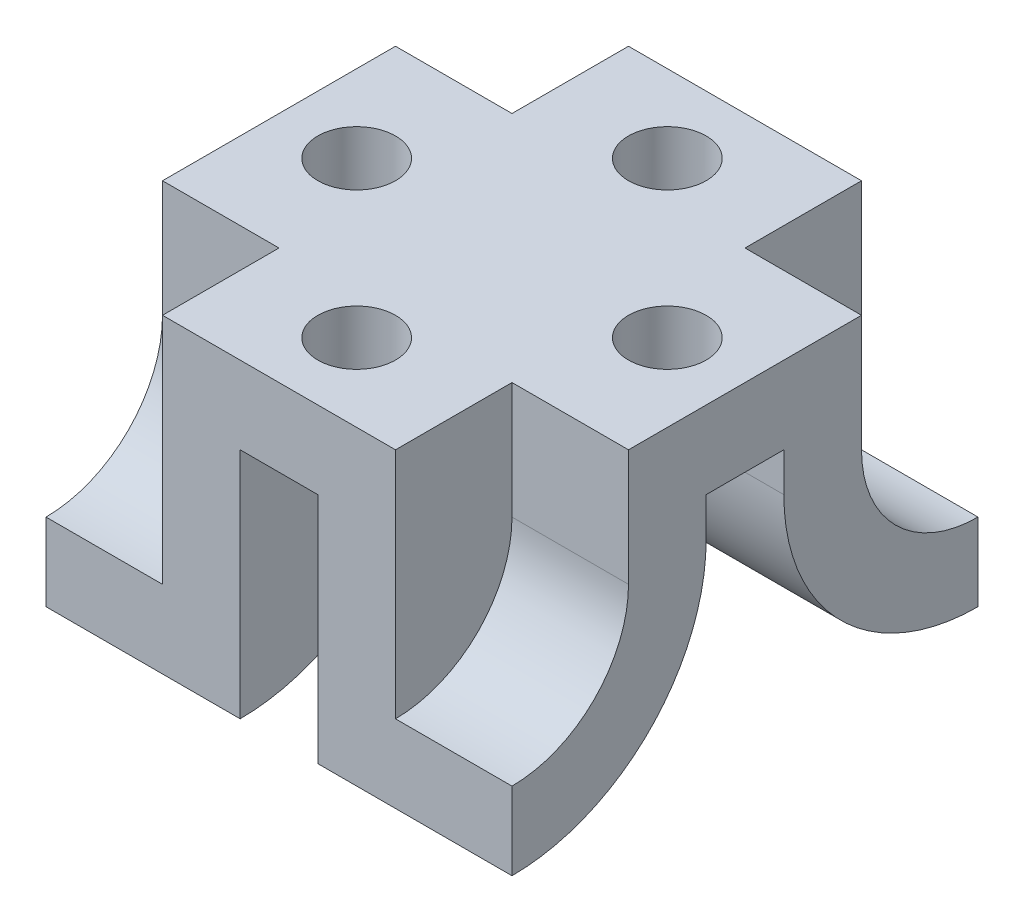
ISO-10303-21;
HEADER;
FILE_DESCRIPTION(('STEP AP214'),'2;1');
FILE_NAME('part.step','',(''),(''),'','','');
FILE_SCHEMA(('AUTOMOTIVE_DESIGN { 1 0 10303 214 1 1 1 1 }'));
ENDSEC;
DATA;
#1=APPLICATION_CONTEXT('core data for automotive mechanical design processes');
#2=APPLICATION_PROTOCOL_DEFINITION('international standard','automotive_design',2000,#1);
#3=PRODUCT_CONTEXT('',#1,'mechanical');
#4=PRODUCT('Part','Part','',(#3));
#5=PRODUCT_RELATED_PRODUCT_CATEGORY('part','',(#4));
#6=PRODUCT_DEFINITION_FORMATION('','',#4);
#7=PRODUCT_DEFINITION_CONTEXT('part definition',#1,'design');
#8=PRODUCT_DEFINITION('design','',#6,#7);
#9=PRODUCT_DEFINITION_SHAPE('','',#8);
#10=(LENGTH_UNIT() NAMED_UNIT(*) SI_UNIT(.MILLI.,.METRE.));
#11=(NAMED_UNIT(*) PLANE_ANGLE_UNIT() SI_UNIT($,.RADIAN.));
#12=(NAMED_UNIT(*) SI_UNIT($,.STERADIAN.) SOLID_ANGLE_UNIT());
#13=UNCERTAINTY_MEASURE_WITH_UNIT(LENGTH_MEASURE(1.E-05),#10,'distance_accuracy_value','');
#14=(GEOMETRIC_REPRESENTATION_CONTEXT(3) GLOBAL_UNCERTAINTY_ASSIGNED_CONTEXT((#13)) GLOBAL_UNIT_ASSIGNED_CONTEXT((#10,
#11,#12)) REPRESENTATION_CONTEXT('',''));
#15=CARTESIAN_POINT('',(0.,0.,0.));
#16=DIRECTION('',(0.,0.,1.));
#17=DIRECTION('',(1.,0.,0.));
#18=AXIS2_PLACEMENT_3D('',#15,#16,#17);
#19=CARTESIAN_POINT('',(0.,12.,-12.));
#20=DIRECTION('',(0.,-1.,0.));
#21=DIRECTION('',(0.,0.,-1.));
#22=AXIS2_PLACEMENT_3D('',#19,#20,#21);
#23=PLANE('',#22);
#24=CARTESIAN_POINT('',(0.,12.,-8.));
#25=DIRECTION('',(0.,-1.,0.));
#26=DIRECTION('',(0.,0.,-1.));
#27=AXIS2_PLACEMENT_3D('',#24,#25,#26);
#28=CIRCLE('',#27,2.);
#29=CARTESIAN_POINT('',(2.,12.,-8.));
#30=VERTEX_POINT('',#29);
#31=CARTESIAN_POINT('',(-2.,12.,-8.));
#32=VERTEX_POINT('',#31);
#33=EDGE_CURVE('E11',#30,#32,#28,.T.);
#34=ORIENTED_EDGE('',*,*,#33,.F.);
#35=DIRECTION('',(0.,0.,1.));
#36=VECTOR('',#35,1.);
#37=CARTESIAN_POINT('',(2.,12.,-12.));
#38=LINE('',#37,#36);
#39=CARTESIAN_POINT('',(2.,12.,-2.));
#40=VERTEX_POINT('',#39);
#41=EDGE_CURVE('E302',#30,#40,#38,.T.);
#42=ORIENTED_EDGE('',*,*,#41,.T.);
#43=DIRECTION('',(1.,0.,0.));
#44=VECTOR('',#43,1.);
#45=CARTESIAN_POINT('',(-12.,12.,-2.));
#46=LINE('',#45,#44);
#47=CARTESIAN_POINT('',(8.,12.,-2.));
#48=VERTEX_POINT('',#47);
#49=EDGE_CURVE('E278',#40,#48,#46,.T.);
#50=ORIENTED_EDGE('',*,*,#49,.T.);
#51=CARTESIAN_POINT('',(8.,12.,0.));
#52=DIRECTION('',(0.,1.,0.));
#53=DIRECTION('',(0.,0.,-1.));
#54=AXIS2_PLACEMENT_3D('',#51,#52,#53);
#55=CIRCLE('',#54,2.);
#56=CARTESIAN_POINT('',(8.,12.,2.));
#57=VERTEX_POINT('',#56);
#58=EDGE_CURVE('E299',#48,#57,#55,.T.);
#59=ORIENTED_EDGE('',*,*,#58,.T.);
#60=DIRECTION('',(1.,0.,0.));
#61=VECTOR('',#60,1.);
#62=CARTESIAN_POINT('',(-12.,12.,2.));
#63=LINE('',#62,#61);
#64=CARTESIAN_POINT('',(2.,12.,2.));
#65=VERTEX_POINT('',#64);
#66=EDGE_CURVE('E288',#65,#57,#63,.T.);
#67=ORIENTED_EDGE('',*,*,#66,.F.);
#68=CARTESIAN_POINT('',(2.,12.,8.));
#69=VERTEX_POINT('',#68);
#70=EDGE_CURVE('E340',#65,#69,#38,.T.);
#71=ORIENTED_EDGE('',*,*,#70,.T.);
#72=CARTESIAN_POINT('',(0.,12.,8.));
#73=DIRECTION('',(0.,-1.,0.));
#74=DIRECTION('',(0.,0.,-1.));
#75=AXIS2_PLACEMENT_3D('',#72,#73,#74);
#76=CIRCLE('',#75,2.);
#77=CARTESIAN_POINT('',(-2.,12.,8.));
#78=VERTEX_POINT('',#77);
#79=EDGE_CURVE('E323',#78,#69,#76,.T.);
#80=ORIENTED_EDGE('',*,*,#79,.F.);
#81=DIRECTION('',(0.,0.,1.));
#82=VECTOR('',#81,1.);
#83=CARTESIAN_POINT('',(-2.,12.,-12.));
#84=LINE('',#83,#82);
#85=CARTESIAN_POINT('',(-2.,12.,2.));
#86=VERTEX_POINT('',#85);
#87=EDGE_CURVE('E334',#86,#78,#84,.T.);
#88=ORIENTED_EDGE('',*,*,#87,.F.);
#89=CARTESIAN_POINT('',(-8.,12.,2.));
#90=VERTEX_POINT('',#89);
#91=EDGE_CURVE('E266',#90,#86,#63,.T.);
#92=ORIENTED_EDGE('',*,*,#91,.F.);
#93=CARTESIAN_POINT('',(-8.,12.,0.));
#94=DIRECTION('',(0.,1.,0.));
#95=DIRECTION('',(0.,0.,1.));
#96=AXIS2_PLACEMENT_3D('',#93,#94,#95);
#97=CIRCLE('',#96,2.);
#98=CARTESIAN_POINT('',(-8.,12.,-2.));
#99=VERTEX_POINT('',#98);
#100=EDGE_CURVE('E252',#90,#99,#97,.T.);
#101=ORIENTED_EDGE('',*,*,#100,.T.);
#102=CARTESIAN_POINT('',(-2.,12.,-2.));
#103=VERTEX_POINT('',#102);
#104=EDGE_CURVE('E263',#99,#103,#46,.T.);
#105=ORIENTED_EDGE('',*,*,#104,.T.);
#106=EDGE_CURVE('E333',#32,#103,#84,.T.);
#107=ORIENTED_EDGE('',*,*,#106,.F.);
#108=EDGE_LOOP('',(#34,#42,#50,#59,#67,#71,#80,#88,#92,#101,#105,#107));
#109=FACE_BOUND('',#108,.T.);
#110=ADVANCED_FACE('F41',(#109),#23,.T.);
#111=CARTESIAN_POINT('',(0.,12.,-8.));
#112=DIRECTION('',(0.,1.,0.));
#113=DIRECTION('',(0.,0.,1.));
#114=AXIS2_PLACEMENT_3D('',#111,#112,#113);
#115=CIRCLE('',#114,2.);
#116=EDGE_CURVE('E968',#30,#32,#115,.T.);
#117=ORIENTED_EDGE('',*,*,#116,.T.);
#118=CARTESIAN_POINT('',(-2.,12.,-12.));
#119=VERTEX_POINT('',#118);
#120=EDGE_CURVE('E328',#119,#32,#84,.T.);
#121=ORIENTED_EDGE('',*,*,#120,.F.);
#122=DIRECTION('',(1.,0.,0.));
#123=VECTOR('',#122,1.);
#124=CARTESIAN_POINT('',(0.,12.,-12.));
#125=LINE('',#124,#123);
#126=CARTESIAN_POINT('',(2.,12.,-12.));
#127=VERTEX_POINT('',#126);
#128=EDGE_CURVE('E421',#119,#127,#125,.T.);
#129=ORIENTED_EDGE('',*,*,#128,.T.);
#130=EDGE_CURVE('E335',#127,#30,#38,.T.);
#131=ORIENTED_EDGE('',*,*,#130,.T.);
#132=EDGE_LOOP('',(#117,#121,#129,#131));
#133=FACE_BOUND('',#132,.T.);
#134=ADVANCED_FACE('F689',(#133),#23,.T.);
#135=CARTESIAN_POINT('',(8.,12.,0.));
#136=DIRECTION('',(0.,-1.,0.));
#137=DIRECTION('',(0.,0.,-1.));
#138=AXIS2_PLACEMENT_3D('',#135,#136,#137);
#139=CIRCLE('',#138,2.);
#140=EDGE_CURVE('E50',#48,#57,#139,.T.);
#141=ORIENTED_EDGE('',*,*,#140,.F.);
#142=CARTESIAN_POINT('',(12.,12.,-2.));
#143=VERTEX_POINT('',#142);
#144=EDGE_CURVE('E280',#48,#143,#46,.T.);
#145=ORIENTED_EDGE('',*,*,#144,.T.);
#146=DIRECTION('',(0.,0.,-1.));
#147=VECTOR('',#146,1.);
#148=CARTESIAN_POINT('',(12.,12.,0.));
#149=LINE('',#148,#147);
#150=CARTESIAN_POINT('',(12.,12.,2.));
#151=VERTEX_POINT('',#150);
#152=EDGE_CURVE('E318',#151,#143,#149,.T.);
#153=ORIENTED_EDGE('',*,*,#152,.F.);
#154=EDGE_CURVE('E286',#57,#151,#63,.T.);
#155=ORIENTED_EDGE('',*,*,#154,.F.);
#156=EDGE_LOOP('',(#141,#145,#153,#155));
#157=FACE_BOUND('',#156,.T.);
#158=ADVANCED_FACE('F317',(#157),#23,.T.);
#159=CARTESIAN_POINT('',(0.,12.,8.));
#160=DIRECTION('',(0.,1.,0.));
#161=DIRECTION('',(0.,0.,-1.));
#162=AXIS2_PLACEMENT_3D('',#159,#160,#161);
#163=CIRCLE('',#162,2.);
#164=EDGE_CURVE('E61',#78,#69,#163,.T.);
#165=ORIENTED_EDGE('',*,*,#164,.T.);
#166=CARTESIAN_POINT('',(2.,12.,12.));
#167=VERTEX_POINT('',#166);
#168=EDGE_CURVE('E332',#69,#167,#38,.T.);
#169=ORIENTED_EDGE('',*,*,#168,.T.);
#170=DIRECTION('',(1.,0.,0.));
#171=VECTOR('',#170,1.);
#172=CARTESIAN_POINT('',(0.,12.,12.));
#173=LINE('',#172,#171);
#174=CARTESIAN_POINT('',(-2.,12.,12.));
#175=VERTEX_POINT('',#174);
#176=EDGE_CURVE('E385',#175,#167,#173,.T.);
#177=ORIENTED_EDGE('',*,*,#176,.F.);
#178=EDGE_CURVE('E396',#78,#175,#84,.T.);
#179=ORIENTED_EDGE('',*,*,#178,.F.);
#180=EDGE_LOOP('',(#165,#169,#177,#179));
#181=FACE_BOUND('',#180,.T.);
#182=ADVANCED_FACE('F481',(#181),#23,.T.);
#183=CARTESIAN_POINT('',(-12.,0.,2.));
#184=DIRECTION('',(0.,0.,-1.));
#185=DIRECTION('',(-1.,0.,0.));
#186=AXIS2_PLACEMENT_3D('',#183,#184,#185);
#187=PLANE('',#186);
#188=DIRECTION('',(1.,0.,0.));
#189=VECTOR('',#188,1.);
#190=CARTESIAN_POINT('',(-12.,10.,2.));
#191=LINE('',#190,#189);
#192=CARTESIAN_POINT('',(2.,10.,2.));
#193=VERTEX_POINT('',#192);
#194=CARTESIAN_POINT('',(12.,10.,2.));
#195=VERTEX_POINT('',#194);
#196=EDGE_CURVE('E458',#193,#195,#191,.T.);
#197=ORIENTED_EDGE('',*,*,#196,.F.);
#198=DIRECTION('',(0.,1.,0.));
#199=VECTOR('',#198,1.);
#200=CARTESIAN_POINT('',(2.,0.,2.));
#201=LINE('',#200,#199);
#202=EDGE_CURVE('E470',#193,#65,#201,.T.);
#203=ORIENTED_EDGE('',*,*,#202,.T.);
#204=ORIENTED_EDGE('',*,*,#66,.T.);
#205=ORIENTED_EDGE('',*,*,#154,.T.);
#206=DIRECTION('',(0.,1.,0.));
#207=VECTOR('',#206,1.);
#208=CARTESIAN_POINT('',(12.,0.,2.));
#209=LINE('',#208,#207);
#210=EDGE_CURVE('E560',#195,#151,#209,.T.);
#211=ORIENTED_EDGE('',*,*,#210,.F.);
#212=EDGE_LOOP('',(#197,#203,#204,#205,#211));
#213=FACE_BOUND('',#212,.T.);
#214=ADVANCED_FACE('F468',(#213),#187,.T.);
#215=CARTESIAN_POINT('',(-12.,0.,-2.));
#216=DIRECTION('',(0.,0.,-1.));
#217=DIRECTION('',(-1.,0.,0.));
#218=AXIS2_PLACEMENT_3D('',#215,#216,#217);
#219=PLANE('',#218);
#220=DIRECTION('',(0.,1.,0.));
#221=VECTOR('',#220,1.);
#222=CARTESIAN_POINT('',(2.,0.,-2.));
#223=LINE('',#222,#221);
#224=CARTESIAN_POINT('',(2.,10.,-2.));
#225=VERTEX_POINT('',#224);
#226=EDGE_CURVE('E308',#225,#40,#223,.T.);
#227=ORIENTED_EDGE('',*,*,#226,.F.);
#228=DIRECTION('',(1.,0.,0.));
#229=VECTOR('',#228,1.);
#230=CARTESIAN_POINT('',(-12.,10.,-2.));
#231=LINE('',#230,#229);
#232=CARTESIAN_POINT('',(12.,10.,-2.));
#233=VERTEX_POINT('',#232);
#234=EDGE_CURVE('E432',#225,#233,#231,.T.);
#235=ORIENTED_EDGE('',*,*,#234,.T.);
#236=DIRECTION('',(0.,1.,0.));
#237=VECTOR('',#236,1.);
#238=CARTESIAN_POINT('',(12.,0.,-2.));
#239=LINE('',#238,#237);
#240=EDGE_CURVE('E312',#233,#143,#239,.T.);
#241=ORIENTED_EDGE('',*,*,#240,.T.);
#242=ORIENTED_EDGE('',*,*,#144,.F.);
#243=ORIENTED_EDGE('',*,*,#49,.F.);
#244=EDGE_LOOP('',(#227,#235,#241,#242,#243));
#245=FACE_BOUND('',#244,.T.);
#246=ADVANCED_FACE('F307',(#245),#219,.F.);
#247=CARTESIAN_POINT('',(-12.,10.,-12.));
#248=DIRECTION('',(1.,0.,0.));
#249=DIRECTION('',(0.,0.,-1.));
#250=AXIS2_PLACEMENT_3D('',#247,#248,#249);
#251=CYLINDRICAL_SURFACE('',#250,10.);
#252=CARTESIAN_POINT('',(2.,10.,-12.));
#253=DIRECTION('',(-1.,0.,0.));
#254=DIRECTION('',(0.,-1.,0.));
#255=AXIS2_PLACEMENT_3D('',#252,#253,#254);
#256=CIRCLE('',#255,10.);
#257=CARTESIAN_POINT('',(2.,0.,-12.));
#258=VERTEX_POINT('',#257);
#259=EDGE_CURVE('E505',#258,#225,#256,.T.);
#260=ORIENTED_EDGE('',*,*,#259,.F.);
#261=DIRECTION('',(-1.,0.,0.));
#262=VECTOR('',#261,1.);
#263=CARTESIAN_POINT('',(0.,0.,-12.));
#264=LINE('',#263,#262);
#265=CARTESIAN_POINT('',(12.,0.,-12.));
#266=VERTEX_POINT('',#265);
#267=EDGE_CURVE('E428',#266,#258,#264,.T.);
#268=ORIENTED_EDGE('',*,*,#267,.F.);
#269=CARTESIAN_POINT('',(12.,10.,-12.));
#270=DIRECTION('',(1.,0.,0.));
#271=DIRECTION('',(0.,0.,-1.));
#272=AXIS2_PLACEMENT_3D('',#269,#270,#271);
#273=CIRCLE('',#272,10.);
#274=EDGE_CURVE('E450',#266,#233,#273,.F.);
#275=ORIENTED_EDGE('',*,*,#274,.T.);
#276=ORIENTED_EDGE('',*,*,#234,.F.);
#277=EDGE_LOOP('',(#260,#268,#275,#276));
#278=FACE_BOUND('',#277,.T.);
#279=ADVANCED_FACE('F741',(#278),#251,.T.);
#280=CARTESIAN_POINT('',(-12.,10.,12.));
#281=DIRECTION('',(1.,0.,0.));
#282=DIRECTION('',(0.,0.,-1.));
#283=AXIS2_PLACEMENT_3D('',#280,#281,#282);
#284=CYLINDRICAL_SURFACE('',#283,10.);
#285=DIRECTION('',(1.,0.,0.));
#286=VECTOR('',#285,1.);
#287=CARTESIAN_POINT('',(0.,0.,12.));
#288=LINE('',#287,#286);
#289=CARTESIAN_POINT('',(2.,0.,12.));
#290=VERTEX_POINT('',#289);
#291=CARTESIAN_POINT('',(12.,0.,12.));
#292=VERTEX_POINT('',#291);
#293=EDGE_CURVE('E381',#290,#292,#288,.T.);
#294=ORIENTED_EDGE('',*,*,#293,.F.);
#295=CARTESIAN_POINT('',(2.,10.,12.));
#296=DIRECTION('',(-1.,0.,0.));
#297=DIRECTION('',(0.,-1.,0.));
#298=AXIS2_PLACEMENT_3D('',#295,#296,#297);
#299=CIRCLE('',#298,10.);
#300=EDGE_CURVE('E485',#290,#193,#299,.F.);
#301=ORIENTED_EDGE('',*,*,#300,.T.);
#302=ORIENTED_EDGE('',*,*,#196,.T.);
#303=CARTESIAN_POINT('',(12.,10.,12.));
#304=DIRECTION('',(1.,0.,0.));
#305=DIRECTION('',(0.,0.,-1.));
#306=AXIS2_PLACEMENT_3D('',#303,#304,#305);
#307=CIRCLE('',#306,10.);
#308=EDGE_CURVE('E446',#292,#195,#307,.T.);
#309=ORIENTED_EDGE('',*,*,#308,.F.);
#310=EDGE_LOOP('',(#294,#301,#302,#309));
#311=FACE_BOUND('',#310,.T.);
#312=ADVANCED_FACE('F651',(#311),#284,.T.);
#313=CARTESIAN_POINT('',(-6.,0.,-12.));
#314=DIRECTION('',(1.,0.,0.));
#315=DIRECTION('',(0.,1.,0.));
#316=AXIS2_PLACEMENT_3D('',#313,#314,#315);
#317=PLANE('',#316);
#318=CARTESIAN_POINT('',(-6.,10.,-12.));
#319=DIRECTION('',(1.,0.,0.));
#320=DIRECTION('',(0.,1.,0.));
#321=AXIS2_PLACEMENT_3D('',#318,#319,#320);
#322=CIRCLE('',#321,6.);
#323=CARTESIAN_POINT('',(-6.,4.,-12.));
#324=VERTEX_POINT('',#323);
#325=CARTESIAN_POINT('',(-6.,10.,-6.));
#326=VERTEX_POINT('',#325);
#327=EDGE_CURVE('E597',#324,#326,#322,.F.);
#328=ORIENTED_EDGE('',*,*,#327,.T.);
#329=DIRECTION('',(0.,1.,0.));
#330=VECTOR('',#329,1.);
#331=CARTESIAN_POINT('',(-6.,0.,-6.));
#332=LINE('',#331,#330);
#333=CARTESIAN_POINT('',(-6.,16.,-6.));
#334=VERTEX_POINT('',#333);
#335=EDGE_CURVE('E453',#326,#334,#332,.T.);
#336=ORIENTED_EDGE('',*,*,#335,.T.);
#337=DIRECTION('',(0.,0.,1.));
#338=VECTOR('',#337,1.);
#339=CARTESIAN_POINT('',(-6.,16.,-12.));
#340=LINE('',#339,#338);
#341=CARTESIAN_POINT('',(-6.,16.,-12.));
#342=VERTEX_POINT('',#341);
#343=EDGE_CURVE('E325',#342,#334,#340,.T.);
#344=ORIENTED_EDGE('',*,*,#343,.F.);
#345=DIRECTION('',(0.,1.,0.));
#346=VECTOR('',#345,1.);
#347=CARTESIAN_POINT('',(-6.,0.,-12.));
#348=LINE('',#347,#346);
#349=EDGE_CURVE('E400',#324,#342,#348,.T.);
#350=ORIENTED_EDGE('',*,*,#349,.F.);
#351=EDGE_LOOP('',(#328,#336,#344,#350));
#352=FACE_BOUND('',#351,.T.);
#353=ADVANCED_FACE('F614',(#352),#317,.F.);
#354=CARTESIAN_POINT('',(6.,0.,-12.));
#355=DIRECTION('',(1.,0.,0.));
#356=DIRECTION('',(0.,0.,-1.));
#357=AXIS2_PLACEMENT_3D('',#354,#355,#356);
#358=PLANE('',#357);
#359=DIRECTION('',(0.,1.,0.));
#360=VECTOR('',#359,1.);
#361=CARTESIAN_POINT('',(6.,0.,-6.));
#362=LINE('',#361,#360);
#363=CARTESIAN_POINT('',(6.,10.,-6.));
#364=VERTEX_POINT('',#363);
#365=CARTESIAN_POINT('',(6.,16.,-6.));
#366=VERTEX_POINT('',#365);
#367=EDGE_CURVE('E608',#364,#366,#362,.T.);
#368=ORIENTED_EDGE('',*,*,#367,.F.);
#369=CARTESIAN_POINT('',(6.,10.,-12.));
#370=DIRECTION('',(1.,0.,0.));
#371=DIRECTION('',(0.,0.,-1.));
#372=AXIS2_PLACEMENT_3D('',#369,#370,#371);
#373=CIRCLE('',#372,6.);
#374=CARTESIAN_POINT('',(6.,4.,-12.));
#375=VERTEX_POINT('',#374);
#376=EDGE_CURVE('E594',#375,#364,#373,.F.);
#377=ORIENTED_EDGE('',*,*,#376,.F.);
#378=DIRECTION('',(0.,1.,0.));
#379=VECTOR('',#378,1.);
#380=CARTESIAN_POINT('',(6.,0.,-12.));
#381=LINE('',#380,#379);
#382=CARTESIAN_POINT('',(6.,16.,-12.));
#383=VERTEX_POINT('',#382);
#384=EDGE_CURVE('E407',#375,#383,#381,.T.);
#385=ORIENTED_EDGE('',*,*,#384,.T.);
#386=DIRECTION('',(0.,0.,1.));
#387=VECTOR('',#386,1.);
#388=CARTESIAN_POINT('',(6.,16.,-12.));
#389=LINE('',#388,#387);
#390=EDGE_CURVE('E341',#383,#366,#389,.T.);
#391=ORIENTED_EDGE('',*,*,#390,.T.);
#392=EDGE_LOOP('',(#368,#377,#385,#391));
#393=FACE_BOUND('',#392,.T.);
#394=ADVANCED_FACE('F864',(#393),#358,.T.);
#395=CARTESIAN_POINT('',(2.,0.,-12.));
#396=DIRECTION('',(-1.,0.,0.));
#397=DIRECTION('',(0.,-1.,0.));
#398=AXIS2_PLACEMENT_3D('',#395,#396,#397);
#399=PLANE('',#398);
#400=ORIENTED_EDGE('',*,*,#70,.F.);
#401=ORIENTED_EDGE('',*,*,#202,.F.);
#402=ORIENTED_EDGE('',*,*,#300,.F.);
#403=DIRECTION('',(0.,-1.,0.));
#404=VECTOR('',#403,1.);
#405=CARTESIAN_POINT('',(2.,0.,12.));
#406=LINE('',#405,#404);
#407=EDGE_CURVE('E382',#167,#290,#406,.T.);
#408=ORIENTED_EDGE('',*,*,#407,.F.);
#409=ORIENTED_EDGE('',*,*,#168,.F.);
#410=EDGE_LOOP('',(#400,#401,#402,#408,#409));
#411=FACE_BOUND('',#410,.T.);
#412=ADVANCED_FACE('F483',(#411),#399,.T.);
#413=CARTESIAN_POINT('',(-2.,0.,-12.));
#414=DIRECTION('',(-1.,0.,0.));
#415=DIRECTION('',(0.,-1.,0.));
#416=AXIS2_PLACEMENT_3D('',#413,#414,#415);
#417=PLANE('',#416);
#418=DIRECTION('',(0.,-1.,0.));
#419=VECTOR('',#418,1.);
#420=CARTESIAN_POINT('',(-2.,0.,12.));
#421=LINE('',#420,#419);
#422=CARTESIAN_POINT('',(-2.,0.,12.));
#423=VERTEX_POINT('',#422);
#424=EDGE_CURVE('E389',#175,#423,#421,.T.);
#425=ORIENTED_EDGE('',*,*,#424,.T.);
#426=CARTESIAN_POINT('',(-2.,10.,12.));
#427=DIRECTION('',(-1.,0.,0.));
#428=DIRECTION('',(0.,-1.,0.));
#429=AXIS2_PLACEMENT_3D('',#426,#427,#428);
#430=CIRCLE('',#429,10.);
#431=CARTESIAN_POINT('',(-2.,10.,2.));
#432=VERTEX_POINT('',#431);
#433=EDGE_CURVE('E494',#423,#432,#430,.F.);
#434=ORIENTED_EDGE('',*,*,#433,.T.);
#435=DIRECTION('',(0.,1.,0.));
#436=VECTOR('',#435,1.);
#437=CARTESIAN_POINT('',(-2.,0.,2.));
#438=LINE('',#437,#436);
#439=EDGE_CURVE('E499',#432,#86,#438,.T.);
#440=ORIENTED_EDGE('',*,*,#439,.T.);
#441=ORIENTED_EDGE('',*,*,#87,.T.);
#442=ORIENTED_EDGE('',*,*,#178,.T.);
#443=EDGE_LOOP('',(#425,#434,#440,#441,#442));
#444=FACE_BOUND('',#443,.T.);
#445=ADVANCED_FACE('F43',(#444),#417,.F.);
#446=DIRECTION('',(0.,-1.,0.));
#447=VECTOR('',#446,1.);
#448=CARTESIAN_POINT('',(2.,0.,-12.));
#449=LINE('',#448,#447);
#450=EDGE_CURVE('E418',#127,#258,#449,.T.);
#451=ORIENTED_EDGE('',*,*,#450,.T.);
#452=ORIENTED_EDGE('',*,*,#259,.T.);
#453=ORIENTED_EDGE('',*,*,#226,.T.);
#454=ORIENTED_EDGE('',*,*,#41,.F.);
#455=ORIENTED_EDGE('',*,*,#130,.F.);
#456=EDGE_LOOP('',(#451,#452,#453,#454,#455));
#457=FACE_BOUND('',#456,.T.);
#458=ADVANCED_FACE('F998',(#457),#399,.T.);
#459=CARTESIAN_POINT('',(-2.,10.,-12.));
#460=DIRECTION('',(-1.,0.,0.));
#461=DIRECTION('',(0.,-1.,0.));
#462=AXIS2_PLACEMENT_3D('',#459,#460,#461);
#463=CIRCLE('',#462,10.);
#464=CARTESIAN_POINT('',(-2.,0.,-12.));
#465=VERTEX_POINT('',#464);
#466=CARTESIAN_POINT('',(-2.,10.,-2.));
#467=VERTEX_POINT('',#466);
#468=EDGE_CURVE('E503',#465,#467,#463,.T.);
#469=ORIENTED_EDGE('',*,*,#468,.F.);
#470=DIRECTION('',(0.,-1.,0.));
#471=VECTOR('',#470,1.);
#472=CARTESIAN_POINT('',(-2.,0.,-12.));
#473=LINE('',#472,#471);
#474=EDGE_CURVE('E425',#119,#465,#473,.T.);
#475=ORIENTED_EDGE('',*,*,#474,.F.);
#476=ORIENTED_EDGE('',*,*,#120,.T.);
#477=ORIENTED_EDGE('',*,*,#106,.T.);
#478=DIRECTION('',(0.,1.,0.));
#479=VECTOR('',#478,1.);
#480=CARTESIAN_POINT('',(-2.,0.,-2.));
#481=LINE('',#480,#479);
#482=EDGE_CURVE('E276',#467,#103,#481,.T.);
#483=ORIENTED_EDGE('',*,*,#482,.F.);
#484=EDGE_LOOP('',(#469,#475,#476,#477,#483));
#485=FACE_BOUND('',#484,.T.);
#486=ADVANCED_FACE('F641',(#485),#417,.F.);
#487=CARTESIAN_POINT('',(-12.,0.,-12.));
#488=DIRECTION('',(1.,0.,0.));
#489=DIRECTION('',(0.,0.,-1.));
#490=AXIS2_PLACEMENT_3D('',#487,#488,#489);
#491=PLANE('',#490);
#492=CARTESIAN_POINT('',(-12.,10.,12.));
#493=DIRECTION('',(1.,0.,0.));
#494=DIRECTION('',(0.,0.,-1.));
#495=AXIS2_PLACEMENT_3D('',#492,#493,#494);
#496=CIRCLE('',#495,10.);
#497=CARTESIAN_POINT('',(-12.,0.,12.));
#498=VERTEX_POINT('',#497);
#499=CARTESIAN_POINT('',(-12.,10.,2.));
#500=VERTEX_POINT('',#499);
#501=EDGE_CURVE('E434',#498,#500,#496,.T.);
#502=ORIENTED_EDGE('',*,*,#501,.F.);
#503=DIRECTION('',(0.,1.,0.));
#504=VECTOR('',#503,1.);
#505=CARTESIAN_POINT('',(-12.,0.,12.));
#506=LINE('',#505,#504);
#507=CARTESIAN_POINT('',(-12.,4.,12.));
#508=VERTEX_POINT('',#507);
#509=EDGE_CURVE('E349',#498,#508,#506,.T.);
#510=ORIENTED_EDGE('',*,*,#509,.T.);
#511=CARTESIAN_POINT('',(-12.,10.,12.));
#512=DIRECTION('',(1.,0.,0.));
#513=DIRECTION('',(0.,0.,-1.));
#514=AXIS2_PLACEMENT_3D('',#511,#512,#513);
#515=CIRCLE('',#514,6.);
#516=CARTESIAN_POINT('',(-12.,10.,6.));
#517=VERTEX_POINT('',#516);
#518=EDGE_CURVE('E529',#508,#517,#515,.T.);
#519=ORIENTED_EDGE('',*,*,#518,.T.);
#520=DIRECTION('',(0.,1.,0.));
#521=VECTOR('',#520,1.);
#522=CARTESIAN_POINT('',(-12.,0.,6.));
#523=LINE('',#522,#521);
#524=CARTESIAN_POINT('',(-12.,16.,6.));
#525=VERTEX_POINT('',#524);
#526=EDGE_CURVE('E526',#517,#525,#523,.T.);
#527=ORIENTED_EDGE('',*,*,#526,.T.);
#528=DIRECTION('',(0.,0.,-1.));
#529=VECTOR('',#528,1.);
#530=CARTESIAN_POINT('',(-12.,16.,0.));
#531=LINE('',#530,#529);
#532=CARTESIAN_POINT('',(-12.,16.,-6.));
#533=VERTEX_POINT('',#532);
#534=EDGE_CURVE('E523',#525,#533,#531,.T.);
#535=ORIENTED_EDGE('',*,*,#534,.T.);
#536=DIRECTION('',(0.,1.,0.));
#537=VECTOR('',#536,1.);
#538=CARTESIAN_POINT('',(-12.,0.,-6.));
#539=LINE('',#538,#537);
#540=CARTESIAN_POINT('',(-12.,10.,-6.));
#541=VERTEX_POINT('',#540);
#542=EDGE_CURVE('E519',#541,#533,#539,.T.);
#543=ORIENTED_EDGE('',*,*,#542,.F.);
#544=CARTESIAN_POINT('',(-12.,10.,-12.));
#545=DIRECTION('',(1.,0.,0.));
#546=DIRECTION('',(0.,0.,-1.));
#547=AXIS2_PLACEMENT_3D('',#544,#545,#546);
#548=CIRCLE('',#547,6.);
#549=CARTESIAN_POINT('',(-12.,4.,-12.));
#550=VERTEX_POINT('',#549);
#551=EDGE_CURVE('E515',#550,#541,#548,.F.);
#552=ORIENTED_EDGE('',*,*,#551,.F.);
#553=DIRECTION('',(0.,1.,0.));
#554=VECTOR('',#553,1.);
#555=CARTESIAN_POINT('',(-12.,0.,-12.));
#556=LINE('',#555,#554);
#557=CARTESIAN_POINT('',(-12.,0.,-12.));
#558=VERTEX_POINT('',#557);
#559=EDGE_CURVE('E393',#558,#550,#556,.T.);
#560=ORIENTED_EDGE('',*,*,#559,.F.);
#561=CARTESIAN_POINT('',(-12.,10.,-12.));
#562=DIRECTION('',(1.,0.,0.));
#563=DIRECTION('',(0.,0.,-1.));
#564=AXIS2_PLACEMENT_3D('',#561,#562,#563);
#565=CIRCLE('',#564,10.);
#566=CARTESIAN_POINT('',(-12.,10.,-2.));
#567=VERTEX_POINT('',#566);
#568=EDGE_CURVE('E438',#558,#567,#565,.F.);
#569=ORIENTED_EDGE('',*,*,#568,.T.);
#570=DIRECTION('',(0.,1.,0.));
#571=VECTOR('',#570,1.);
#572=CARTESIAN_POINT('',(-12.,0.,-2.));
#573=LINE('',#572,#571);
#574=CARTESIAN_POINT('',(-12.,12.,-2.));
#575=VERTEX_POINT('',#574);
#576=EDGE_CURVE('E537',#567,#575,#573,.T.);
#577=ORIENTED_EDGE('',*,*,#576,.T.);
#578=DIRECTION('',(0.,0.,-1.));
#579=VECTOR('',#578,1.);
#580=CARTESIAN_POINT('',(-12.,12.,0.));
#581=LINE('',#580,#579);
#582=CARTESIAN_POINT('',(-12.,12.,2.));
#583=VERTEX_POINT('',#582);
#584=EDGE_CURVE('E284',#583,#575,#581,.T.);
#585=ORIENTED_EDGE('',*,*,#584,.F.);
#586=DIRECTION('',(0.,1.,0.));
#587=VECTOR('',#586,1.);
#588=CARTESIAN_POINT('',(-12.,0.,2.));
#589=LINE('',#588,#587);
#590=EDGE_CURVE('E532',#500,#583,#589,.T.);
#591=ORIENTED_EDGE('',*,*,#590,.F.);
#592=EDGE_LOOP('',(#502,#510,#519,#527,#535,#543,#552,#560,#569,#577,#585,#591));
#593=FACE_BOUND('',#592,.T.);
#594=ADVANCED_FACE('F627',(#593),#491,.F.);
#595=CARTESIAN_POINT('',(-6.,10.,12.));
#596=DIRECTION('',(1.,0.,0.));
#597=DIRECTION('',(0.,1.,0.));
#598=AXIS2_PLACEMENT_3D('',#595,#596,#597);
#599=CIRCLE('',#598,6.);
#600=CARTESIAN_POINT('',(-6.,4.,12.));
#601=VERTEX_POINT('',#600);
#602=CARTESIAN_POINT('',(-6.,10.,6.));
#603=VERTEX_POINT('',#602);
#604=EDGE_CURVE('E590',#601,#603,#599,.T.);
#605=ORIENTED_EDGE('',*,*,#604,.F.);
#606=DIRECTION('',(0.,1.,0.));
#607=VECTOR('',#606,1.);
#608=CARTESIAN_POINT('',(-6.,0.,12.));
#609=LINE('',#608,#607);
#610=CARTESIAN_POINT('',(-6.,16.,12.));
#611=VERTEX_POINT('',#610);
#612=EDGE_CURVE('E357',#601,#611,#609,.T.);
#613=ORIENTED_EDGE('',*,*,#612,.T.);
#614=CARTESIAN_POINT('',(-6.,16.,6.));
#615=VERTEX_POINT('',#614);
#616=EDGE_CURVE('E345',#615,#611,#340,.T.);
#617=ORIENTED_EDGE('',*,*,#616,.F.);
#618=DIRECTION('',(0.,1.,0.));
#619=VECTOR('',#618,1.);
#620=CARTESIAN_POINT('',(-6.,0.,6.));
#621=LINE('',#620,#619);
#622=EDGE_CURVE('E604',#603,#615,#621,.T.);
#623=ORIENTED_EDGE('',*,*,#622,.F.);
#624=EDGE_LOOP('',(#605,#613,#617,#623));
#625=FACE_BOUND('',#624,.T.);
#626=ADVANCED_FACE('F670',(#625),#317,.F.);
#627=CARTESIAN_POINT('',(0.,16.,-12.));
#628=DIRECTION('',(0.,1.,0.));
#629=DIRECTION('',(0.,0.,1.));
#630=AXIS2_PLACEMENT_3D('',#627,#628,#629);
#631=PLANE('',#630);
#632=CARTESIAN_POINT('',(0.,16.,-8.));
#633=DIRECTION('',(0.,1.,0.));
#634=DIRECTION('',(0.,0.,1.));
#635=AXIS2_PLACEMENT_3D('',#632,#633,#634);
#636=CIRCLE('',#635,2.);
#637=CARTESIAN_POINT('',(0.,16.,-6.));
#638=VERTEX_POINT('',#637);
#639=EDGE_CURVE('E269',#638,#638,#636,.T.);
#640=ORIENTED_EDGE('',*,*,#639,.F.);
#641=EDGE_LOOP('',(#640));
#642=FACE_BOUND('',#641,.T.);
#643=CARTESIAN_POINT('',(-8.,16.,0.));
#644=DIRECTION('',(0.,1.,0.));
#645=DIRECTION('',(0.,0.,1.));
#646=AXIS2_PLACEMENT_3D('',#643,#644,#645);
#647=CIRCLE('',#646,2.);
#648=CARTESIAN_POINT('',(-8.,16.,2.));
#649=VERTEX_POINT('',#648);
#650=EDGE_CURVE('E257',#649,#649,#647,.T.);
#651=ORIENTED_EDGE('',*,*,#650,.F.);
#652=EDGE_LOOP('',(#651));
#653=FACE_BOUND('',#652,.T.);
#654=CARTESIAN_POINT('',(8.,16.,0.));
#655=DIRECTION('',(0.,1.,0.));
#656=DIRECTION('',(0.,0.,-1.));
#657=AXIS2_PLACEMENT_3D('',#654,#655,#656);
#658=CIRCLE('',#657,2.);
#659=CARTESIAN_POINT('',(8.,16.,-2.));
#660=VERTEX_POINT('',#659);
#661=EDGE_CURVE('E982',#660,#660,#658,.T.);
#662=ORIENTED_EDGE('',*,*,#661,.F.);
#663=EDGE_LOOP('',(#662));
#664=FACE_BOUND('',#663,.T.);
#665=CARTESIAN_POINT('',(0.,16.,8.));
#666=DIRECTION('',(0.,1.,0.));
#667=DIRECTION('',(0.,0.,-1.));
#668=AXIS2_PLACEMENT_3D('',#665,#666,#667);
#669=CIRCLE('',#668,2.);
#670=CARTESIAN_POINT('',(0.,16.,6.));
#671=VERTEX_POINT('',#670);
#672=EDGE_CURVE('E988',#671,#671,#669,.T.);
#673=ORIENTED_EDGE('',*,*,#672,.F.);
#674=EDGE_LOOP('',(#673));
#675=FACE_BOUND('',#674,.T.);
#676=ORIENTED_EDGE('',*,*,#343,.T.);
#677=DIRECTION('',(1.,0.,0.));
#678=VECTOR('',#677,1.);
#679=CARTESIAN_POINT('',(-12.,16.,-6.));
#680=LINE('',#679,#678);
#681=EDGE_CURVE('E578',#533,#334,#680,.T.);
#682=ORIENTED_EDGE('',*,*,#681,.F.);
#683=ORIENTED_EDGE('',*,*,#534,.F.);
#684=DIRECTION('',(1.,0.,0.));
#685=VECTOR('',#684,1.);
#686=CARTESIAN_POINT('',(-12.,16.,6.));
#687=LINE('',#686,#685);
#688=EDGE_CURVE('E573',#525,#615,#687,.T.);
#689=ORIENTED_EDGE('',*,*,#688,.T.);
#690=ORIENTED_EDGE('',*,*,#616,.T.);
#691=DIRECTION('',(-1.,0.,0.));
#692=VECTOR('',#691,1.);
#693=CARTESIAN_POINT('',(0.,16.,12.));
#694=LINE('',#693,#692);
#695=CARTESIAN_POINT('',(6.,16.,12.));
#696=VERTEX_POINT('',#695);
#697=EDGE_CURVE('E361',#696,#611,#694,.T.);
#698=ORIENTED_EDGE('',*,*,#697,.F.);
#699=CARTESIAN_POINT('',(6.,16.,6.));
#700=VERTEX_POINT('',#699);
#701=EDGE_CURVE('E339',#700,#696,#389,.T.);
#702=ORIENTED_EDGE('',*,*,#701,.F.);
#703=CARTESIAN_POINT('',(12.,16.,6.));
#704=VERTEX_POINT('',#703);
#705=EDGE_CURVE('E577',#700,#704,#687,.T.);
#706=ORIENTED_EDGE('',*,*,#705,.T.);
#707=DIRECTION('',(0.,0.,-1.));
#708=VECTOR('',#707,1.);
#709=CARTESIAN_POINT('',(12.,16.,0.));
#710=LINE('',#709,#708);
#711=CARTESIAN_POINT('',(12.,16.,-6.));
#712=VERTEX_POINT('',#711);
#713=EDGE_CURVE('E548',#704,#712,#710,.T.);
#714=ORIENTED_EDGE('',*,*,#713,.T.);
#715=EDGE_CURVE('E582',#366,#712,#680,.T.);
#716=ORIENTED_EDGE('',*,*,#715,.F.);
#717=ORIENTED_EDGE('',*,*,#390,.F.);
#718=DIRECTION('',(-1.,0.,0.));
#719=VECTOR('',#718,1.);
#720=CARTESIAN_POINT('',(0.,16.,-12.));
#721=LINE('',#720,#719);
#722=EDGE_CURVE('E403',#383,#342,#721,.T.);
#723=ORIENTED_EDGE('',*,*,#722,.T.);
#724=EDGE_LOOP('',(#676,#682,#683,#689,#690,#698,#702,#706,#714,#716,#717,#723));
#725=FACE_BOUND('',#724,.T.);
#726=ADVANCED_FACE('F620',(#642,#653,#664,#675,#725),#631,.T.);
#727=DIRECTION('',(0.,1.,0.));
#728=VECTOR('',#727,1.);
#729=CARTESIAN_POINT('',(6.,0.,12.));
#730=LINE('',#729,#728);
#731=CARTESIAN_POINT('',(6.,4.,12.));
#732=VERTEX_POINT('',#731);
#733=EDGE_CURVE('E365',#732,#696,#730,.T.);
#734=ORIENTED_EDGE('',*,*,#733,.F.);
#735=CARTESIAN_POINT('',(6.,10.,12.));
#736=DIRECTION('',(1.,0.,0.));
#737=DIRECTION('',(0.,0.,-1.));
#738=AXIS2_PLACEMENT_3D('',#735,#736,#737);
#739=CIRCLE('',#738,6.);
#740=CARTESIAN_POINT('',(6.,10.,6.));
#741=VERTEX_POINT('',#740);
#742=EDGE_CURVE('E571',#732,#741,#739,.T.);
#743=ORIENTED_EDGE('',*,*,#742,.T.);
#744=DIRECTION('',(0.,1.,0.));
#745=VECTOR('',#744,1.);
#746=CARTESIAN_POINT('',(6.,0.,6.));
#747=LINE('',#746,#745);
#748=EDGE_CURVE('E600',#741,#700,#747,.T.);
#749=ORIENTED_EDGE('',*,*,#748,.T.);
#750=ORIENTED_EDGE('',*,*,#701,.T.);
#751=EDGE_LOOP('',(#734,#743,#749,#750));
#752=FACE_BOUND('',#751,.T.);
#753=ADVANCED_FACE('F663',(#752),#358,.T.);
#754=CARTESIAN_POINT('',(12.,0.,-12.));
#755=DIRECTION('',(1.,0.,0.));
#756=DIRECTION('',(0.,0.,-1.));
#757=AXIS2_PLACEMENT_3D('',#754,#755,#756);
#758=PLANE('',#757);
#759=DIRECTION('',(0.,1.,0.));
#760=VECTOR('',#759,1.);
#761=CARTESIAN_POINT('',(12.,0.,12.));
#762=LINE('',#761,#760);
#763=CARTESIAN_POINT('',(12.,4.,12.));
#764=VERTEX_POINT('',#763);
#765=EDGE_CURVE('E373',#292,#764,#762,.T.);
#766=ORIENTED_EDGE('',*,*,#765,.F.);
#767=ORIENTED_EDGE('',*,*,#308,.T.);
#768=ORIENTED_EDGE('',*,*,#210,.T.);
#769=ORIENTED_EDGE('',*,*,#152,.T.);
#770=ORIENTED_EDGE('',*,*,#240,.F.);
#771=ORIENTED_EDGE('',*,*,#274,.F.);
#772=DIRECTION('',(0.,1.,0.));
#773=VECTOR('',#772,1.);
#774=CARTESIAN_POINT('',(12.,0.,-12.));
#775=LINE('',#774,#773);
#776=CARTESIAN_POINT('',(12.,4.,-12.));
#777=VERTEX_POINT('',#776);
#778=EDGE_CURVE('E414',#266,#777,#775,.T.);
#779=ORIENTED_EDGE('',*,*,#778,.T.);
#780=CARTESIAN_POINT('',(12.,10.,-12.));
#781=DIRECTION('',(1.,0.,0.));
#782=DIRECTION('',(0.,0.,-1.));
#783=AXIS2_PLACEMENT_3D('',#780,#781,#782);
#784=CIRCLE('',#783,6.);
#785=CARTESIAN_POINT('',(12.,10.,-6.));
#786=VERTEX_POINT('',#785);
#787=EDGE_CURVE('E514',#777,#786,#784,.F.);
#788=ORIENTED_EDGE('',*,*,#787,.T.);
#789=DIRECTION('',(0.,1.,0.));
#790=VECTOR('',#789,1.);
#791=CARTESIAN_POINT('',(12.,0.,-6.));
#792=LINE('',#791,#790);
#793=EDGE_CURVE('E544',#786,#712,#792,.T.);
#794=ORIENTED_EDGE('',*,*,#793,.T.);
#795=ORIENTED_EDGE('',*,*,#713,.F.);
#796=DIRECTION('',(0.,1.,0.));
#797=VECTOR('',#796,1.);
#798=CARTESIAN_POINT('',(12.,0.,6.));
#799=LINE('',#798,#797);
#800=CARTESIAN_POINT('',(12.,10.,6.));
#801=VERTEX_POINT('',#800);
#802=EDGE_CURVE('E552',#801,#704,#799,.T.);
#803=ORIENTED_EDGE('',*,*,#802,.F.);
#804=CARTESIAN_POINT('',(12.,10.,12.));
#805=DIRECTION('',(1.,0.,0.));
#806=DIRECTION('',(0.,0.,-1.));
#807=AXIS2_PLACEMENT_3D('',#804,#805,#806);
#808=CIRCLE('',#807,6.);
#809=EDGE_CURVE('E556',#764,#801,#808,.T.);
#810=ORIENTED_EDGE('',*,*,#809,.F.);
#811=EDGE_LOOP('',(#766,#767,#768,#769,#770,#771,#779,#788,#794,#795,#803,#810));
#812=FACE_BOUND('',#811,.T.);
#813=ADVANCED_FACE('F654',(#812),#758,.T.);
#814=EDGE_CURVE('E248',#99,#90,#97,.T.);
#815=ORIENTED_EDGE('',*,*,#814,.T.);
#816=EDGE_CURVE('E290',#583,#90,#63,.T.);
#817=ORIENTED_EDGE('',*,*,#816,.F.);
#818=ORIENTED_EDGE('',*,*,#584,.T.);
#819=EDGE_CURVE('E274',#575,#99,#46,.T.);
#820=ORIENTED_EDGE('',*,*,#819,.T.);
#821=EDGE_LOOP('',(#815,#817,#818,#820));
#822=FACE_BOUND('',#821,.T.);
#823=ADVANCED_FACE('F282',(#822),#23,.T.);
#824=CARTESIAN_POINT('',(0.,0.,-12.));
#825=DIRECTION('',(0.,0.,1.));
#826=DIRECTION('',(1.,0.,0.));
#827=AXIS2_PLACEMENT_3D('',#824,#825,#826);
#828=PLANE('',#827);
#829=ORIENTED_EDGE('',*,*,#474,.T.);
#830=EDGE_CURVE('E352',#465,#558,#264,.T.);
#831=ORIENTED_EDGE('',*,*,#830,.T.);
#832=ORIENTED_EDGE('',*,*,#559,.T.);
#833=DIRECTION('',(1.,0.,0.));
#834=VECTOR('',#833,1.);
#835=CARTESIAN_POINT('',(0.,4.,-12.));
#836=LINE('',#835,#834);
#837=EDGE_CURVE('E397',#550,#324,#836,.T.);
#838=ORIENTED_EDGE('',*,*,#837,.T.);
#839=ORIENTED_EDGE('',*,*,#349,.T.);
#840=ORIENTED_EDGE('',*,*,#722,.F.);
#841=ORIENTED_EDGE('',*,*,#384,.F.);
#842=DIRECTION('',(-1.,0.,0.));
#843=VECTOR('',#842,1.);
#844=CARTESIAN_POINT('',(0.,4.,-12.));
#845=LINE('',#844,#843);
#846=EDGE_CURVE('E411',#777,#375,#845,.T.);
#847=ORIENTED_EDGE('',*,*,#846,.F.);
#848=ORIENTED_EDGE('',*,*,#778,.F.);
#849=ORIENTED_EDGE('',*,*,#267,.T.);
#850=ORIENTED_EDGE('',*,*,#450,.F.);
#851=ORIENTED_EDGE('',*,*,#128,.F.);
#852=EDGE_LOOP('',(#829,#831,#832,#838,#839,#840,#841,#847,#848,#849,#850,#851));
#853=FACE_BOUND('',#852,.T.);
#854=ADVANCED_FACE('F633',(#853),#828,.F.);
#855=CARTESIAN_POINT('',(0.,0.,12.));
#856=DIRECTION('',(0.,0.,1.));
#857=DIRECTION('',(1.,0.,0.));
#858=AXIS2_PLACEMENT_3D('',#855,#856,#857);
#859=PLANE('',#858);
#860=EDGE_CURVE('E377',#498,#423,#288,.T.);
#861=ORIENTED_EDGE('',*,*,#860,.T.);
#862=ORIENTED_EDGE('',*,*,#424,.F.);
#863=ORIENTED_EDGE('',*,*,#176,.T.);
#864=ORIENTED_EDGE('',*,*,#407,.T.);
#865=ORIENTED_EDGE('',*,*,#293,.T.);
#866=ORIENTED_EDGE('',*,*,#765,.T.);
#867=DIRECTION('',(-1.,0.,0.));
#868=VECTOR('',#867,1.);
#869=CARTESIAN_POINT('',(0.,4.,12.));
#870=LINE('',#869,#868);
#871=EDGE_CURVE('E369',#764,#732,#870,.T.);
#872=ORIENTED_EDGE('',*,*,#871,.T.);
#873=ORIENTED_EDGE('',*,*,#733,.T.);
#874=ORIENTED_EDGE('',*,*,#697,.T.);
#875=ORIENTED_EDGE('',*,*,#612,.F.);
#876=DIRECTION('',(1.,0.,0.));
#877=VECTOR('',#876,1.);
#878=CARTESIAN_POINT('',(0.,4.,12.));
#879=LINE('',#878,#877);
#880=EDGE_CURVE('E353',#508,#601,#879,.T.);
#881=ORIENTED_EDGE('',*,*,#880,.F.);
#882=ORIENTED_EDGE('',*,*,#509,.F.);
#883=EDGE_LOOP('',(#861,#862,#863,#864,#865,#866,#872,#873,#874,#875,#881,#882));
#884=FACE_BOUND('',#883,.T.);
#885=ADVANCED_FACE('F489',(#884),#859,.T.);
#886=ORIENTED_EDGE('',*,*,#439,.F.);
#887=EDGE_CURVE('E392',#500,#432,#191,.T.);
#888=ORIENTED_EDGE('',*,*,#887,.F.);
#889=ORIENTED_EDGE('',*,*,#590,.T.);
#890=ORIENTED_EDGE('',*,*,#816,.T.);
#891=ORIENTED_EDGE('',*,*,#91,.T.);
#892=EDGE_LOOP('',(#886,#888,#889,#890,#891));
#893=FACE_BOUND('',#892,.T.);
#894=ADVANCED_FACE('F677',(#893),#187,.T.);
#895=EDGE_CURVE('E293',#567,#467,#231,.T.);
#896=ORIENTED_EDGE('',*,*,#895,.T.);
#897=ORIENTED_EDGE('',*,*,#482,.T.);
#898=ORIENTED_EDGE('',*,*,#104,.F.);
#899=ORIENTED_EDGE('',*,*,#819,.F.);
#900=ORIENTED_EDGE('',*,*,#576,.F.);
#901=EDGE_LOOP('',(#896,#897,#898,#899,#900));
#902=FACE_BOUND('',#901,.T.);
#903=ADVANCED_FACE('F272',(#902),#219,.F.);
#904=ORIENTED_EDGE('',*,*,#830,.F.);
#905=ORIENTED_EDGE('',*,*,#468,.T.);
#906=ORIENTED_EDGE('',*,*,#895,.F.);
#907=ORIENTED_EDGE('',*,*,#568,.F.);
#908=EDGE_LOOP('',(#904,#905,#906,#907));
#909=FACE_BOUND('',#908,.T.);
#910=ADVANCED_FACE('F637',(#909),#251,.T.);
#911=ORIENTED_EDGE('',*,*,#433,.F.);
#912=ORIENTED_EDGE('',*,*,#860,.F.);
#913=ORIENTED_EDGE('',*,*,#501,.T.);
#914=ORIENTED_EDGE('',*,*,#887,.T.);
#915=EDGE_LOOP('',(#911,#912,#913,#914));
#916=FACE_BOUND('',#915,.T.);
#917=ADVANCED_FACE('F497',(#916),#284,.T.);
#918=CARTESIAN_POINT('',(-12.,10.,-12.));
#919=DIRECTION('',(1.,0.,0.));
#920=DIRECTION('',(0.,0.,-1.));
#921=AXIS2_PLACEMENT_3D('',#918,#919,#920);
#922=CYLINDRICAL_SURFACE('',#921,6.);
#923=ORIENTED_EDGE('',*,*,#846,.T.);
#924=ORIENTED_EDGE('',*,*,#376,.T.);
#925=DIRECTION('',(1.,0.,0.));
#926=VECTOR('',#925,1.);
#927=CARTESIAN_POINT('',(-12.,10.,-6.));
#928=LINE('',#927,#926);
#929=EDGE_CURVE('E540',#364,#786,#928,.T.);
#930=ORIENTED_EDGE('',*,*,#929,.T.);
#931=ORIENTED_EDGE('',*,*,#787,.F.);
#932=EDGE_LOOP('',(#923,#924,#930,#931));
#933=FACE_BOUND('',#932,.T.);
#934=ADVANCED_FACE('F729',(#933),#922,.F.);
#935=CARTESIAN_POINT('',(-12.,10.,12.));
#936=DIRECTION('',(1.,0.,0.));
#937=DIRECTION('',(0.,0.,-1.));
#938=AXIS2_PLACEMENT_3D('',#935,#936,#937);
#939=CYLINDRICAL_SURFACE('',#938,6.);
#940=ORIENTED_EDGE('',*,*,#742,.F.);
#941=ORIENTED_EDGE('',*,*,#871,.F.);
#942=ORIENTED_EDGE('',*,*,#809,.T.);
#943=DIRECTION('',(1.,0.,0.));
#944=VECTOR('',#943,1.);
#945=CARTESIAN_POINT('',(-12.,10.,6.));
#946=LINE('',#945,#944);
#947=EDGE_CURVE('E572',#741,#801,#946,.T.);
#948=ORIENTED_EDGE('',*,*,#947,.F.);
#949=EDGE_LOOP('',(#940,#941,#942,#948));
#950=FACE_BOUND('',#949,.T.);
#951=ADVANCED_FACE('F659',(#950),#939,.F.);
#952=CARTESIAN_POINT('',(-12.,0.,-6.));
#953=DIRECTION('',(0.,0.,-1.));
#954=DIRECTION('',(-1.,0.,0.));
#955=AXIS2_PLACEMENT_3D('',#952,#953,#954);
#956=PLANE('',#955);
#957=ORIENTED_EDGE('',*,*,#929,.F.);
#958=ORIENTED_EDGE('',*,*,#367,.T.);
#959=ORIENTED_EDGE('',*,*,#715,.T.);
#960=ORIENTED_EDGE('',*,*,#793,.F.);
#961=EDGE_LOOP('',(#957,#958,#959,#960));
#962=FACE_BOUND('',#961,.T.);
#963=ADVANCED_FACE('F811',(#962),#956,.T.);
#964=CARTESIAN_POINT('',(-12.,0.,6.));
#965=DIRECTION('',(0.,0.,-1.));
#966=DIRECTION('',(-1.,0.,0.));
#967=AXIS2_PLACEMENT_3D('',#964,#965,#966);
#968=PLANE('',#967);
#969=ORIENTED_EDGE('',*,*,#748,.F.);
#970=ORIENTED_EDGE('',*,*,#947,.T.);
#971=ORIENTED_EDGE('',*,*,#802,.T.);
#972=ORIENTED_EDGE('',*,*,#705,.F.);
#973=EDGE_LOOP('',(#969,#970,#971,#972));
#974=FACE_BOUND('',#973,.T.);
#975=ADVANCED_FACE('F792',(#974),#968,.F.);
#976=ORIENTED_EDGE('',*,*,#327,.F.);
#977=ORIENTED_EDGE('',*,*,#837,.F.);
#978=ORIENTED_EDGE('',*,*,#551,.T.);
#979=EDGE_CURVE('E583',#541,#326,#928,.T.);
#980=ORIENTED_EDGE('',*,*,#979,.T.);
#981=EDGE_LOOP('',(#976,#977,#978,#980));
#982=FACE_BOUND('',#981,.T.);
#983=ADVANCED_FACE('F631',(#982),#922,.F.);
#984=ORIENTED_EDGE('',*,*,#335,.F.);
#985=ORIENTED_EDGE('',*,*,#979,.F.);
#986=ORIENTED_EDGE('',*,*,#542,.T.);
#987=ORIENTED_EDGE('',*,*,#681,.T.);
#988=EDGE_LOOP('',(#984,#985,#986,#987));
#989=FACE_BOUND('',#988,.T.);
#990=ADVANCED_FACE('F623',(#989),#956,.T.);
#991=ORIENTED_EDGE('',*,*,#880,.T.);
#992=ORIENTED_EDGE('',*,*,#604,.T.);
#993=EDGE_CURVE('E567',#517,#603,#946,.T.);
#994=ORIENTED_EDGE('',*,*,#993,.F.);
#995=ORIENTED_EDGE('',*,*,#518,.F.);
#996=EDGE_LOOP('',(#991,#992,#994,#995));
#997=FACE_BOUND('',#996,.T.);
#998=ADVANCED_FACE('F675',(#997),#939,.F.);
#999=ORIENTED_EDGE('',*,*,#993,.T.);
#1000=ORIENTED_EDGE('',*,*,#622,.T.);
#1001=ORIENTED_EDGE('',*,*,#688,.F.);
#1002=ORIENTED_EDGE('',*,*,#526,.F.);
#1003=EDGE_LOOP('',(#999,#1000,#1001,#1002));
#1004=FACE_BOUND('',#1003,.T.);
#1005=ADVANCED_FACE('F784',(#1004),#968,.F.);
#1006=CARTESIAN_POINT('',(0.,12.,8.));
#1007=DIRECTION('',(0.,1.,0.));
#1008=DIRECTION('',(0.,0.,1.));
#1009=AXIS2_PLACEMENT_3D('',#1006,#1007,#1008);
#1010=CYLINDRICAL_SURFACE('',#1009,2.);
#1011=ORIENTED_EDGE('',*,*,#164,.F.);
#1012=ORIENTED_EDGE('',*,*,#79,.T.);
#1013=EDGE_LOOP('',(#1011,#1012));
#1014=FACE_BOUND('',#1013,.T.);
#1015=ORIENTED_EDGE('',*,*,#672,.T.);
#1016=EDGE_LOOP('',(#1015));
#1017=FACE_BOUND('',#1016,.T.);
#1018=ADVANCED_FACE('F789',(#1014,#1017),#1010,.F.);
#1019=CARTESIAN_POINT('',(8.,12.,0.));
#1020=DIRECTION('',(0.,1.,0.));
#1021=DIRECTION('',(0.,0.,1.));
#1022=AXIS2_PLACEMENT_3D('',#1019,#1020,#1021);
#1023=CYLINDRICAL_SURFACE('',#1022,2.);
#1024=ORIENTED_EDGE('',*,*,#58,.F.);
#1025=ORIENTED_EDGE('',*,*,#140,.T.);
#1026=EDGE_LOOP('',(#1024,#1025));
#1027=FACE_BOUND('',#1026,.T.);
#1028=ORIENTED_EDGE('',*,*,#661,.T.);
#1029=EDGE_LOOP('',(#1028));
#1030=FACE_BOUND('',#1029,.T.);
#1031=ADVANCED_FACE('F938',(#1027,#1030),#1023,.F.);
#1032=CARTESIAN_POINT('',(-8.,12.,0.));
#1033=DIRECTION('',(0.,1.,0.));
#1034=DIRECTION('',(0.,0.,1.));
#1035=AXIS2_PLACEMENT_3D('',#1032,#1033,#1034);
#1036=CYLINDRICAL_SURFACE('',#1035,2.);
#1037=ORIENTED_EDGE('',*,*,#100,.F.);
#1038=ORIENTED_EDGE('',*,*,#814,.F.);
#1039=EDGE_LOOP('',(#1037,#1038));
#1040=FACE_BOUND('',#1039,.T.);
#1041=ORIENTED_EDGE('',*,*,#650,.T.);
#1042=EDGE_LOOP('',(#1041));
#1043=FACE_BOUND('',#1042,.T.);
#1044=ADVANCED_FACE('F250',(#1040,#1043),#1036,.F.);
#1045=CARTESIAN_POINT('',(0.,12.,-8.));
#1046=DIRECTION('',(0.,1.,0.));
#1047=DIRECTION('',(0.,0.,1.));
#1048=AXIS2_PLACEMENT_3D('',#1045,#1046,#1047);
#1049=CYLINDRICAL_SURFACE('',#1048,2.);
#1050=ORIENTED_EDGE('',*,*,#116,.F.);
#1051=ORIENTED_EDGE('',*,*,#33,.T.);
#1052=EDGE_LOOP('',(#1050,#1051));
#1053=FACE_BOUND('',#1052,.T.);
#1054=ORIENTED_EDGE('',*,*,#639,.T.);
#1055=EDGE_LOOP('',(#1054));
#1056=FACE_BOUND('',#1055,.T.);
#1057=ADVANCED_FACE('F955',(#1053,#1056),#1049,.F.);
#1058=CLOSED_SHELL('',(#110,#134,#158,#182,#214,#246,#279,#312,#353,#394,#412,#445,#458,#486,
#594,#626,#726,#753,#813,#823,#854,#885,#894,#903,#910,#917,#934,#951,#963,#975,#983,#990,#998,
#1005,#1018,#1031,#1044,#1057));
#1059=MANIFOLD_SOLID_BREP('B2',#1058);
#1060=ADVANCED_BREP_SHAPE_REPRESENTATION('',(#18,#1059),#14);
#1061=SHAPE_DEFINITION_REPRESENTATION(#9,#1060);
ENDSEC;
END-ISO-10303-21;
